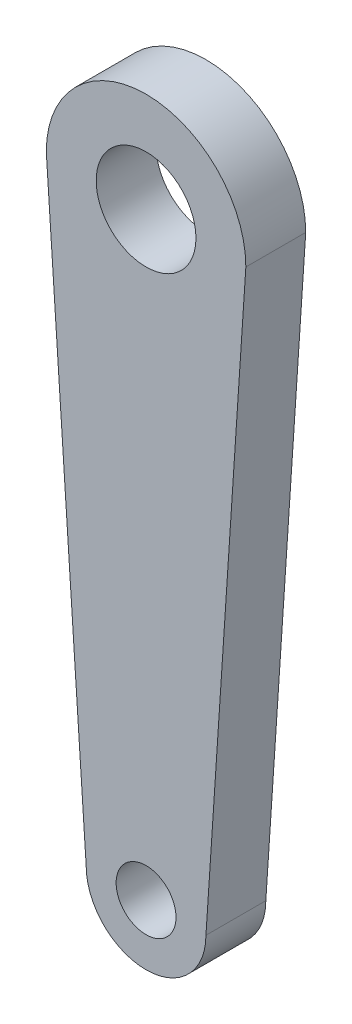
ISO-10303-21;
HEADER;
FILE_DESCRIPTION(('STEP AP214'),'2;1');
FILE_NAME('part.step','',(''),(''),'','','');
FILE_SCHEMA(('AUTOMOTIVE_DESIGN { 1 0 10303 214 1 1 1 1 }'));
ENDSEC;
DATA;
#1=APPLICATION_CONTEXT('core data for automotive mechanical design processes');
#2=APPLICATION_PROTOCOL_DEFINITION('international standard','automotive_design',2000,#1);
#3=PRODUCT_CONTEXT('',#1,'mechanical');
#4=PRODUCT('Part','Part','',(#3));
#5=PRODUCT_RELATED_PRODUCT_CATEGORY('part','',(#4));
#6=PRODUCT_DEFINITION_FORMATION('','',#4);
#7=PRODUCT_DEFINITION_CONTEXT('part definition',#1,'design');
#8=PRODUCT_DEFINITION('design','',#6,#7);
#9=PRODUCT_DEFINITION_SHAPE('','',#8);
#10=(LENGTH_UNIT() NAMED_UNIT(*) SI_UNIT(.MILLI.,.METRE.));
#11=(NAMED_UNIT(*) PLANE_ANGLE_UNIT() SI_UNIT($,.RADIAN.));
#12=(NAMED_UNIT(*) SI_UNIT($,.STERADIAN.) SOLID_ANGLE_UNIT());
#13=UNCERTAINTY_MEASURE_WITH_UNIT(LENGTH_MEASURE(1.E-05),#10,'distance_accuracy_value','');
#14=(GEOMETRIC_REPRESENTATION_CONTEXT(3) GLOBAL_UNCERTAINTY_ASSIGNED_CONTEXT((#13)) GLOBAL_UNIT_ASSIGNED_CONTEXT((#10,
#11,#12)) REPRESENTATION_CONTEXT('',''));
#15=CARTESIAN_POINT('',(0.,0.,0.));
#16=DIRECTION('',(0.,0.,1.));
#17=DIRECTION('',(1.,0.,0.));
#18=AXIS2_PLACEMENT_3D('',#15,#16,#17);
#19=CARTESIAN_POINT('',(0.,0.,3.));
#20=DIRECTION('',(0.,0.,-1.));
#21=DIRECTION('',(-1.,0.,0.));
#22=AXIS2_PLACEMENT_3D('',#19,#20,#21);
#23=CYLINDRICAL_SURFACE('',#22,5.);
#24=CARTESIAN_POINT('',(0.,0.,0.));
#25=DIRECTION('',(0.,0.,1.));
#26=DIRECTION('',(1.,0.,0.));
#27=AXIS2_PLACEMENT_3D('',#24,#25,#26);
#28=CIRCLE('',#27,5.);
#29=CARTESIAN_POINT('',(5.,0.,0.));
#30=VERTEX_POINT('',#29);
#31=CARTESIAN_POINT('',(-5.,0.,0.));
#32=VERTEX_POINT('',#31);
#33=EDGE_CURVE('E99',#30,#32,#28,.T.);
#34=ORIENTED_EDGE('',*,*,#33,.T.);
#35=DIRECTION('',(0.,0.,-1.));
#36=VECTOR('',#35,1.);
#37=CARTESIAN_POINT('',(-5.,0.,3.));
#38=LINE('',#37,#36);
#39=CARTESIAN_POINT('',(-5.,0.,3.));
#40=VERTEX_POINT('',#39);
#41=EDGE_CURVE('E11',#40,#32,#38,.T.);
#42=ORIENTED_EDGE('',*,*,#41,.F.);
#43=CARTESIAN_POINT('',(0.,0.,3.));
#44=DIRECTION('',(0.,0.,1.));
#45=DIRECTION('',(1.,0.,0.));
#46=AXIS2_PLACEMENT_3D('',#43,#44,#45);
#47=CIRCLE('',#46,5.);
#48=CARTESIAN_POINT('',(5.,0.,3.));
#49=VERTEX_POINT('',#48);
#50=EDGE_CURVE('E87',#49,#40,#47,.T.);
#51=ORIENTED_EDGE('',*,*,#50,.F.);
#52=DIRECTION('',(0.,0.,-1.));
#53=VECTOR('',#52,1.);
#54=CARTESIAN_POINT('',(5.,0.,3.));
#55=LINE('',#54,#53);
#56=EDGE_CURVE('E95',#49,#30,#55,.T.);
#57=ORIENTED_EDGE('',*,*,#56,.T.);
#58=EDGE_LOOP('',(#34,#42,#51,#57));
#59=FACE_BOUND('',#58,.T.);
#60=ADVANCED_FACE('F36',(#59),#23,.T.);
#61=CARTESIAN_POINT('',(-5.,0.,3.));
#62=DIRECTION('',(0.997785157856609,0.066519010523774,0.));
#63=DIRECTION('',(-0.0665190105237741,0.997785157856609,0.));
#64=AXIS2_PLACEMENT_3D('',#61,#62,#63);
#65=PLANE('',#64);
#66=DIRECTION('',(0.066519010523774,-0.997785157856609,0.));
#67=VECTOR('',#66,1.);
#68=CARTESIAN_POINT('',(-5.,0.,0.));
#69=LINE('',#68,#67);
#70=CARTESIAN_POINT('',(-3.,-30.,0.));
#71=VERTEX_POINT('',#70);
#72=EDGE_CURVE('E91',#32,#71,#69,.T.);
#73=ORIENTED_EDGE('',*,*,#72,.T.);
#74=DIRECTION('',(0.,0.,-1.));
#75=VECTOR('',#74,1.);
#76=CARTESIAN_POINT('',(-3.,-30.,3.));
#77=LINE('',#76,#75);
#78=CARTESIAN_POINT('',(-3.,-30.,3.));
#79=VERTEX_POINT('',#78);
#80=EDGE_CURVE('E44',#79,#71,#77,.T.);
#81=ORIENTED_EDGE('',*,*,#80,.F.);
#82=DIRECTION('',(0.066519010523774,-0.997785157856609,0.));
#83=VECTOR('',#82,1.);
#84=CARTESIAN_POINT('',(-5.,0.,3.));
#85=LINE('',#84,#83);
#86=EDGE_CURVE('E82',#40,#79,#85,.T.);
#87=ORIENTED_EDGE('',*,*,#86,.F.);
#88=ORIENTED_EDGE('',*,*,#41,.T.);
#89=EDGE_LOOP('',(#73,#81,#87,#88));
#90=FACE_BOUND('',#89,.T.);
#91=ADVANCED_FACE('F90',(#90),#65,.F.);
#92=CARTESIAN_POINT('',(0.,-30.,3.));
#93=DIRECTION('',(0.,0.,-1.));
#94=DIRECTION('',(-1.,0.,0.));
#95=AXIS2_PLACEMENT_3D('',#92,#93,#94);
#96=CYLINDRICAL_SURFACE('',#95,3.);
#97=CARTESIAN_POINT('',(0.,-30.,0.));
#98=DIRECTION('',(0.,0.,1.));
#99=DIRECTION('',(1.,0.,0.));
#100=AXIS2_PLACEMENT_3D('',#97,#98,#99);
#101=CIRCLE('',#100,3.);
#102=CARTESIAN_POINT('',(3.,-30.,0.));
#103=VERTEX_POINT('',#102);
#104=EDGE_CURVE('E69',#71,#103,#101,.T.);
#105=ORIENTED_EDGE('',*,*,#104,.T.);
#106=DIRECTION('',(0.,0.,-1.));
#107=VECTOR('',#106,1.);
#108=CARTESIAN_POINT('',(3.,-30.,3.));
#109=LINE('',#108,#107);
#110=CARTESIAN_POINT('',(3.,-30.,3.));
#111=VERTEX_POINT('',#110);
#112=EDGE_CURVE('E92',#111,#103,#109,.T.);
#113=ORIENTED_EDGE('',*,*,#112,.F.);
#114=CARTESIAN_POINT('',(0.,-30.,3.));
#115=DIRECTION('',(0.,0.,1.));
#116=DIRECTION('',(1.,0.,0.));
#117=AXIS2_PLACEMENT_3D('',#114,#115,#116);
#118=CIRCLE('',#117,3.);
#119=EDGE_CURVE('E85',#79,#111,#118,.T.);
#120=ORIENTED_EDGE('',*,*,#119,.F.);
#121=ORIENTED_EDGE('',*,*,#80,.T.);
#122=EDGE_LOOP('',(#105,#113,#120,#121));
#123=FACE_BOUND('',#122,.T.);
#124=ADVANCED_FACE('F93',(#123),#96,.T.);
#125=CARTESIAN_POINT('',(5.,0.,3.));
#126=DIRECTION('',(-0.997785157856609,0.0665190105237738,0.));
#127=DIRECTION('',(-0.0665190105237738,-0.997785157856609,0.));
#128=AXIS2_PLACEMENT_3D('',#125,#126,#127);
#129=PLANE('',#128);
#130=DIRECTION('',(0.0665190105237738,0.997785157856609,0.));
#131=VECTOR('',#130,1.);
#132=CARTESIAN_POINT('',(5.,0.,0.));
#133=LINE('',#132,#131);
#134=EDGE_CURVE('E75',#103,#30,#133,.T.);
#135=ORIENTED_EDGE('',*,*,#134,.T.);
#136=ORIENTED_EDGE('',*,*,#56,.F.);
#137=DIRECTION('',(0.0665190105237738,0.997785157856609,0.));
#138=VECTOR('',#137,1.);
#139=CARTESIAN_POINT('',(5.,0.,3.));
#140=LINE('',#139,#138);
#141=EDGE_CURVE('E52',#111,#49,#140,.T.);
#142=ORIENTED_EDGE('',*,*,#141,.F.);
#143=ORIENTED_EDGE('',*,*,#112,.T.);
#144=EDGE_LOOP('',(#135,#136,#142,#143));
#145=FACE_BOUND('',#144,.T.);
#146=ADVANCED_FACE('F107',(#145),#129,.F.);
#147=CARTESIAN_POINT('',(0.,0.,3.));
#148=DIRECTION('',(0.,0.,1.));
#149=DIRECTION('',(1.,0.,0.));
#150=AXIS2_PLACEMENT_3D('',#147,#148,#149);
#151=PLANE('',#150);
#152=CARTESIAN_POINT('',(0.,-29.9733308923197,3.));
#153=DIRECTION('',(0.,0.,1.));
#154=DIRECTION('',(1.,0.,0.));
#155=AXIS2_PLACEMENT_3D('',#152,#153,#154);
#156=CIRCLE('',#155,1.5);
#157=CARTESIAN_POINT('',(1.5,-29.9733308923197,3.));
#158=VERTEX_POINT('',#157);
#159=EDGE_CURVE('E119',#158,#158,#156,.T.);
#160=ORIENTED_EDGE('',*,*,#159,.F.);
#161=EDGE_LOOP('',(#160));
#162=FACE_BOUND('',#161,.T.);
#163=CARTESIAN_POINT('',(0.,0.,3.));
#164=DIRECTION('',(0.,0.,1.));
#165=DIRECTION('',(1.,0.,0.));
#166=AXIS2_PLACEMENT_3D('',#163,#164,#165);
#167=CIRCLE('',#166,2.5);
#168=CARTESIAN_POINT('',(2.5,0.,3.));
#169=VERTEX_POINT('',#168);
#170=EDGE_CURVE('E113',#169,#169,#167,.T.);
#171=ORIENTED_EDGE('',*,*,#170,.F.);
#172=EDGE_LOOP('',(#171));
#173=FACE_BOUND('',#172,.T.);
#174=ORIENTED_EDGE('',*,*,#50,.T.);
#175=ORIENTED_EDGE('',*,*,#86,.T.);
#176=ORIENTED_EDGE('',*,*,#119,.T.);
#177=ORIENTED_EDGE('',*,*,#141,.T.);
#178=EDGE_LOOP('',(#174,#175,#176,#177));
#179=FACE_BOUND('',#178,.T.);
#180=ADVANCED_FACE('F83',(#162,#173,#179),#151,.T.);
#181=CARTESIAN_POINT('',(0.,0.,0.));
#182=DIRECTION('',(0.,0.,1.));
#183=DIRECTION('',(1.,0.,0.));
#184=AXIS2_PLACEMENT_3D('',#181,#182,#183);
#185=PLANE('',#184);
#186=CARTESIAN_POINT('',(0.,-29.9733308923197,0.));
#187=DIRECTION('',(0.,0.,1.));
#188=DIRECTION('',(1.,0.,0.));
#189=AXIS2_PLACEMENT_3D('',#186,#187,#188);
#190=CIRCLE('',#189,1.5);
#191=CARTESIAN_POINT('',(1.5,-29.9733308923197,0.));
#192=VERTEX_POINT('',#191);
#193=EDGE_CURVE('E116',#192,#192,#190,.T.);
#194=ORIENTED_EDGE('',*,*,#193,.T.);
#195=EDGE_LOOP('',(#194));
#196=FACE_BOUND('',#195,.T.);
#197=CARTESIAN_POINT('',(0.,0.,0.));
#198=DIRECTION('',(0.,0.,1.));
#199=DIRECTION('',(1.,0.,0.));
#200=AXIS2_PLACEMENT_3D('',#197,#198,#199);
#201=CIRCLE('',#200,2.5);
#202=CARTESIAN_POINT('',(2.5,0.,0.));
#203=VERTEX_POINT('',#202);
#204=EDGE_CURVE('E102',#203,#203,#201,.T.);
#205=ORIENTED_EDGE('',*,*,#204,.T.);
#206=EDGE_LOOP('',(#205));
#207=FACE_BOUND('',#206,.T.);
#208=ORIENTED_EDGE('',*,*,#33,.F.);
#209=ORIENTED_EDGE('',*,*,#134,.F.);
#210=ORIENTED_EDGE('',*,*,#104,.F.);
#211=ORIENTED_EDGE('',*,*,#72,.F.);
#212=EDGE_LOOP('',(#208,#209,#210,#211));
#213=FACE_BOUND('',#212,.T.);
#214=ADVANCED_FACE('F110',(#196,#207,#213),#185,.F.);
#215=CARTESIAN_POINT('',(0.,0.,0.));
#216=DIRECTION('',(0.,0.,1.));
#217=DIRECTION('',(1.,0.,0.));
#218=AXIS2_PLACEMENT_3D('',#215,#216,#217);
#219=CYLINDRICAL_SURFACE('',#218,2.5);
#220=ORIENTED_EDGE('',*,*,#204,.F.);
#221=EDGE_LOOP('',(#220));
#222=FACE_BOUND('',#221,.T.);
#223=ORIENTED_EDGE('',*,*,#170,.T.);
#224=EDGE_LOOP('',(#223));
#225=FACE_BOUND('',#224,.T.);
#226=ADVANCED_FACE('F130',(#222,#225),#219,.F.);
#227=CARTESIAN_POINT('',(0.,-29.9733308923197,0.));
#228=DIRECTION('',(0.,0.,1.));
#229=DIRECTION('',(1.,0.,0.));
#230=AXIS2_PLACEMENT_3D('',#227,#228,#229);
#231=CYLINDRICAL_SURFACE('',#230,1.5);
#232=ORIENTED_EDGE('',*,*,#193,.F.);
#233=EDGE_LOOP('',(#232));
#234=FACE_BOUND('',#233,.T.);
#235=ORIENTED_EDGE('',*,*,#159,.T.);
#236=EDGE_LOOP('',(#235));
#237=FACE_BOUND('',#236,.T.);
#238=ADVANCED_FACE('F127',(#234,#237),#231,.F.);
#239=CLOSED_SHELL('',(#60,#91,#124,#146,#180,#214,#226,#238));
#240=MANIFOLD_SOLID_BREP('B2',#239);
#241=ADVANCED_BREP_SHAPE_REPRESENTATION('',(#18,#240),#14);
#242=SHAPE_DEFINITION_REPRESENTATION(#9,#241);
ENDSEC;
END-ISO-10303-21;
